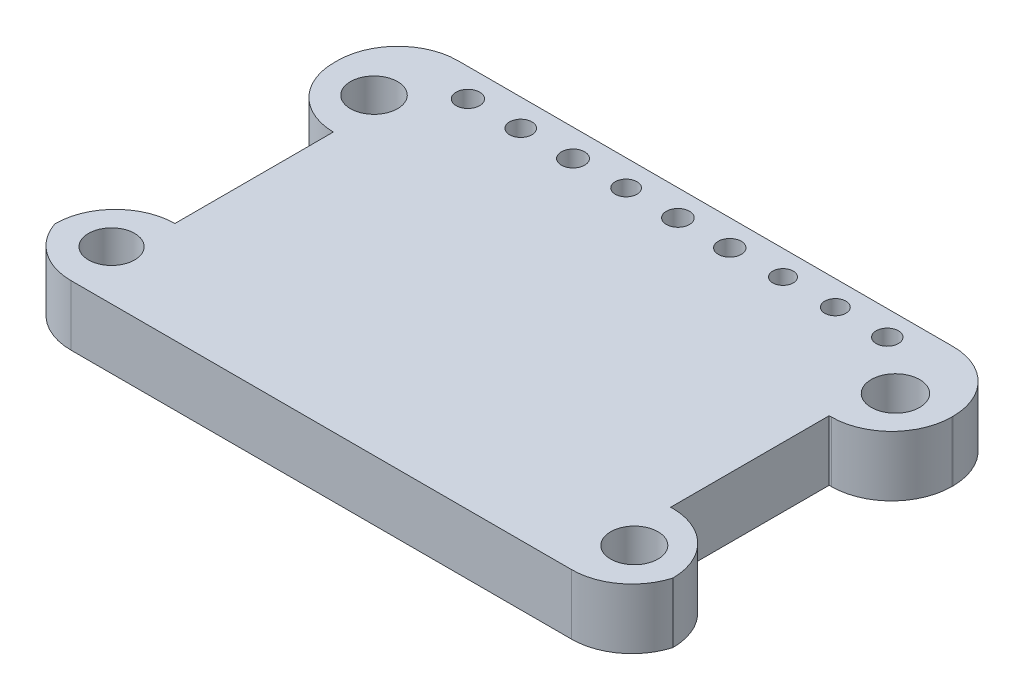
ISO-10303-21;
HEADER;
FILE_DESCRIPTION(('STEP AP214'),'2;1');
FILE_NAME('part.step','',(''),(''),'','','');
FILE_SCHEMA(('AUTOMOTIVE_DESIGN { 1 0 10303 214 1 1 1 1 }'));
ENDSEC;
DATA;
#1=APPLICATION_CONTEXT('core data for automotive mechanical design processes');
#2=APPLICATION_PROTOCOL_DEFINITION('international standard','automotive_design',2000,#1);
#3=PRODUCT_CONTEXT('',#1,'mechanical');
#4=PRODUCT('Part','Part','',(#3));
#5=PRODUCT_RELATED_PRODUCT_CATEGORY('part','',(#4));
#6=PRODUCT_DEFINITION_FORMATION('','',#4);
#7=PRODUCT_DEFINITION_CONTEXT('part definition',#1,'design');
#8=PRODUCT_DEFINITION('design','',#6,#7);
#9=PRODUCT_DEFINITION_SHAPE('','',#8);
#10=(LENGTH_UNIT() NAMED_UNIT(*) SI_UNIT(.MILLI.,.METRE.));
#11=(NAMED_UNIT(*) PLANE_ANGLE_UNIT() SI_UNIT($,.RADIAN.));
#12=(NAMED_UNIT(*) SI_UNIT($,.STERADIAN.) SOLID_ANGLE_UNIT());
#13=UNCERTAINTY_MEASURE_WITH_UNIT(LENGTH_MEASURE(1.E-05),#10,'distance_accuracy_value','');
#14=(GEOMETRIC_REPRESENTATION_CONTEXT(3) GLOBAL_UNCERTAINTY_ASSIGNED_CONTEXT((#13)) GLOBAL_UNIT_ASSIGNED_CONTEXT((#10,
#11,#12)) REPRESENTATION_CONTEXT('',''));
#15=CARTESIAN_POINT('',(0.,0.,0.));
#16=DIRECTION('',(0.,0.,1.));
#17=DIRECTION('',(1.,0.,0.));
#18=AXIS2_PLACEMENT_3D('',#15,#16,#17);
#19=CARTESIAN_POINT('',(30.65,3.,0.));
#20=DIRECTION('',(-1.,0.,0.));
#21=DIRECTION('',(0.,0.,1.));
#22=AXIS2_PLACEMENT_3D('',#19,#20,#21);
#23=PLANE('',#22);
#24=DIRECTION('',(0.,0.,-1.));
#25=VECTOR('',#24,1.);
#26=CARTESIAN_POINT('',(30.65,0.,0.));
#27=LINE('',#26,#25);
#28=CARTESIAN_POINT('',(30.65,0.,-16.0433014459896));
#29=VERTEX_POINT('',#28);
#30=CARTESIAN_POINT('',(30.65,0.,-16.11));
#31=VERTEX_POINT('',#30);
#32=EDGE_CURVE('E217',#29,#31,#27,.T.);
#33=ORIENTED_EDGE('',*,*,#32,.T.);
#34=DIRECTION('',(0.,-1.,0.));
#35=VECTOR('',#34,1.);
#36=CARTESIAN_POINT('',(30.65,3.,-16.11));
#37=LINE('',#36,#35);
#38=CARTESIAN_POINT('',(30.65,3.,-16.11));
#39=VERTEX_POINT('',#38);
#40=EDGE_CURVE('E200',#31,#39,#37,.F.);
#41=ORIENTED_EDGE('',*,*,#40,.T.);
#42=DIRECTION('',(0.,0.,-1.));
#43=VECTOR('',#42,1.);
#44=CARTESIAN_POINT('',(30.65,3.,0.));
#45=LINE('',#44,#43);
#46=CARTESIAN_POINT('',(30.65,3.,-16.0433014459896));
#47=VERTEX_POINT('',#46);
#48=EDGE_CURVE('E266',#47,#39,#45,.T.);
#49=ORIENTED_EDGE('',*,*,#48,.F.);
#50=DIRECTION('',(0.,1.,0.));
#51=VECTOR('',#50,1.);
#52=CARTESIAN_POINT('',(30.65,3.,-16.0433014459896));
#53=LINE('',#52,#51);
#54=EDGE_CURVE('E238',#47,#29,#53,.F.);
#55=ORIENTED_EDGE('',*,*,#54,.T.);
#56=EDGE_LOOP('',(#33,#41,#49,#55));
#57=FACE_BOUND('',#56,.T.);
#58=ADVANCED_FACE('F38',(#57),#23,.F.);
#59=CARTESIAN_POINT('',(0.,3.,0.));
#60=DIRECTION('',(1.,0.,0.));
#61=DIRECTION('',(0.,0.,-1.));
#62=AXIS2_PLACEMENT_3D('',#59,#60,#61);
#63=PLANE('',#62);
#64=DIRECTION('',(0.,0.,1.));
#65=VECTOR('',#64,1.);
#66=CARTESIAN_POINT('',(0.,3.,0.));
#67=LINE('',#66,#65);
#68=CARTESIAN_POINT('',(0.,3.,-16.11));
#69=VERTEX_POINT('',#68);
#70=CARTESIAN_POINT('',(0.,3.,-15.9336723742656));
#71=VERTEX_POINT('',#70);
#72=EDGE_CURVE('E229',#69,#71,#67,.T.);
#73=ORIENTED_EDGE('',*,*,#72,.F.);
#74=DIRECTION('',(0.,-1.,0.));
#75=VECTOR('',#74,1.);
#76=CARTESIAN_POINT('',(0.,3.,-16.11));
#77=LINE('',#76,#75);
#78=CARTESIAN_POINT('',(0.,0.,-16.11));
#79=VERTEX_POINT('',#78);
#80=EDGE_CURVE('E11',#69,#79,#77,.T.);
#81=ORIENTED_EDGE('',*,*,#80,.T.);
#82=DIRECTION('',(0.,0.,1.));
#83=VECTOR('',#82,1.);
#84=CARTESIAN_POINT('',(0.,0.,0.));
#85=LINE('',#84,#83);
#86=CARTESIAN_POINT('',(0.,0.,-15.9336723742656));
#87=VERTEX_POINT('',#86);
#88=EDGE_CURVE('E218',#79,#87,#85,.T.);
#89=ORIENTED_EDGE('',*,*,#88,.T.);
#90=DIRECTION('',(0.,-1.,0.));
#91=VECTOR('',#90,1.);
#92=CARTESIAN_POINT('',(0.,3.,-15.9336723742656));
#93=LINE('',#92,#91);
#94=EDGE_CURVE('E178',#87,#71,#93,.F.);
#95=ORIENTED_EDGE('',*,*,#94,.T.);
#96=EDGE_LOOP('',(#73,#81,#89,#95));
#97=FACE_BOUND('',#96,.T.);
#98=ADVANCED_FACE('F255',(#97),#63,.F.);
#99=CARTESIAN_POINT('',(0.,3.,0.));
#100=DIRECTION('',(0.,0.,-1.));
#101=DIRECTION('',(-1.,0.,0.));
#102=AXIS2_PLACEMENT_3D('',#99,#100,#101);
#103=PLANE('',#102);
#104=DIRECTION('',(1.,0.,0.));
#105=VECTOR('',#104,1.);
#106=CARTESIAN_POINT('',(0.,3.,0.));
#107=LINE('',#106,#105);
#108=CARTESIAN_POINT('',(2.84562995765223,3.,0.));
#109=VERTEX_POINT('',#108);
#110=CARTESIAN_POINT('',(27.7713387546784,3.,0.));
#111=VERTEX_POINT('',#110);
#112=EDGE_CURVE('E214',#109,#111,#107,.T.);
#113=ORIENTED_EDGE('',*,*,#112,.F.);
#114=DIRECTION('',(0.,1.,0.));
#115=VECTOR('',#114,1.);
#116=CARTESIAN_POINT('',(2.84562995765223,3.,0.));
#117=LINE('',#116,#115);
#118=CARTESIAN_POINT('',(2.84562995765223,0.,0.));
#119=VERTEX_POINT('',#118);
#120=EDGE_CURVE('E46',#109,#119,#117,.F.);
#121=ORIENTED_EDGE('',*,*,#120,.T.);
#122=DIRECTION('',(1.,0.,0.));
#123=VECTOR('',#122,1.);
#124=CARTESIAN_POINT('',(0.,0.,0.));
#125=LINE('',#124,#123);
#126=CARTESIAN_POINT('',(27.7713387546784,0.,0.));
#127=VERTEX_POINT('',#126);
#128=EDGE_CURVE('E213',#119,#127,#125,.T.);
#129=ORIENTED_EDGE('',*,*,#128,.T.);
#130=DIRECTION('',(0.,1.,0.));
#131=VECTOR('',#130,1.);
#132=CARTESIAN_POINT('',(27.7713387546784,3.,0.));
#133=LINE('',#132,#131);
#134=EDGE_CURVE('E53',#127,#111,#133,.T.);
#135=ORIENTED_EDGE('',*,*,#134,.T.);
#136=EDGE_LOOP('',(#113,#121,#129,#135));
#137=FACE_BOUND('',#136,.T.);
#138=ADVANCED_FACE('F212',(#137),#103,.F.);
#139=CARTESIAN_POINT('',(0.,3.,-19.11));
#140=DIRECTION('',(0.,0.,1.));
#141=DIRECTION('',(1.,0.,0.));
#142=AXIS2_PLACEMENT_3D('',#139,#140,#141);
#143=PLANE('',#142);
#144=DIRECTION('',(-1.,0.,0.));
#145=VECTOR('',#144,1.);
#146=CARTESIAN_POINT('',(0.,3.,-19.11));
#147=LINE('',#146,#145);
#148=CARTESIAN_POINT('',(27.65,3.,-19.11));
#149=VERTEX_POINT('',#148);
#150=CARTESIAN_POINT('',(3.,3.,-19.11));
#151=VERTEX_POINT('',#150);
#152=EDGE_CURVE('E234',#149,#151,#147,.T.);
#153=ORIENTED_EDGE('',*,*,#152,.F.);
#154=DIRECTION('',(0.,-1.,0.));
#155=VECTOR('',#154,1.);
#156=CARTESIAN_POINT('',(27.65,3.,-19.11));
#157=LINE('',#156,#155);
#158=CARTESIAN_POINT('',(27.65,0.,-19.11));
#159=VERTEX_POINT('',#158);
#160=EDGE_CURVE('E189',#149,#159,#157,.T.);
#161=ORIENTED_EDGE('',*,*,#160,.T.);
#162=DIRECTION('',(-1.,0.,0.));
#163=VECTOR('',#162,1.);
#164=CARTESIAN_POINT('',(0.,0.,-19.11));
#165=LINE('',#164,#163);
#166=CARTESIAN_POINT('',(3.,0.,-19.11));
#167=VERTEX_POINT('',#166);
#168=EDGE_CURVE('E221',#159,#167,#165,.T.);
#169=ORIENTED_EDGE('',*,*,#168,.T.);
#170=DIRECTION('',(0.,-1.,0.));
#171=VECTOR('',#170,1.);
#172=CARTESIAN_POINT('',(3.,3.,-19.11));
#173=LINE('',#172,#171);
#174=EDGE_CURVE('E182',#167,#151,#173,.F.);
#175=ORIENTED_EDGE('',*,*,#174,.T.);
#176=EDGE_LOOP('',(#153,#161,#169,#175));
#177=FACE_BOUND('',#176,.T.);
#178=ADVANCED_FACE('F261',(#177),#143,.F.);
#179=CARTESIAN_POINT('',(0.,3.,0.));
#180=DIRECTION('',(0.,-1.,0.));
#181=DIRECTION('',(0.,0.,-1.));
#182=AXIS2_PLACEMENT_3D('',#179,#180,#181);
#183=PLANE('',#182);
#184=CARTESIAN_POINT('',(23.0182736628564,3.,-17.8750131787133));
#185=DIRECTION('',(0.,1.,0.));
#186=DIRECTION('',(0.,0.,1.));
#187=AXIS2_PLACEMENT_3D('',#184,#185,#186);
#188=CIRCLE('',#187,0.526160779684508);
#189=CARTESIAN_POINT('',(23.0182736628564,3.,-17.3488523990288));
#190=VERTEX_POINT('',#189);
#191=EDGE_CURVE('E366',#190,#190,#188,.T.);
#192=ORIENTED_EDGE('',*,*,#191,.F.);
#193=EDGE_LOOP('',(#192));
#194=FACE_BOUND('',#193,.T.);
#195=CARTESIAN_POINT('',(20.4146410542592,3.,-17.8750131787133));
#196=DIRECTION('',(0.,1.,0.));
#197=DIRECTION('',(0.,0.,1.));
#198=AXIS2_PLACEMENT_3D('',#195,#196,#197);
#199=CIRCLE('',#198,0.5116223200349);
#200=CARTESIAN_POINT('',(20.4146410542592,3.,-17.3633908586784));
#201=VERTEX_POINT('',#200);
#202=EDGE_CURVE('E360',#201,#201,#199,.T.);
#203=ORIENTED_EDGE('',*,*,#202,.F.);
#204=EDGE_LOOP('',(#203));
#205=FACE_BOUND('',#204,.T.);
#206=CARTESIAN_POINT('',(17.8321852748269,3.,-17.8080853071805));
#207=DIRECTION('',(0.,1.,0.));
#208=DIRECTION('',(0.,0.,1.));
#209=AXIS2_PLACEMENT_3D('',#206,#207,#208);
#210=CIRCLE('',#209,0.570497963200171);
#211=CARTESIAN_POINT('',(17.8321852748269,3.,-17.2375873439803));
#212=VERTEX_POINT('',#211);
#213=EDGE_CURVE('E354',#212,#212,#210,.T.);
#214=ORIENTED_EDGE('',*,*,#213,.F.);
#215=EDGE_LOOP('',(#214));
#216=FACE_BOUND('',#215,.T.);
#217=CARTESIAN_POINT('',(15.2505882629512,3.,-17.8080853071805));
#218=DIRECTION('',(0.,1.,0.));
#219=DIRECTION('',(0.,0.,1.));
#220=AXIS2_PLACEMENT_3D('',#217,#218,#219);
#221=CIRCLE('',#220,0.574861319265319);
#222=CARTESIAN_POINT('',(15.2505882629512,3.,-17.2332239879152));
#223=VERTEX_POINT('',#222);
#224=EDGE_CURVE('E348',#223,#223,#221,.T.);
#225=ORIENTED_EDGE('',*,*,#224,.F.);
#226=EDGE_LOOP('',(#225));
#227=FACE_BOUND('',#226,.T.);
#228=CARTESIAN_POINT('',(12.6729514407486,3.,-17.8080853071805));
#229=DIRECTION('',(0.,1.,0.));
#230=DIRECTION('',(0.,0.,1.));
#231=AXIS2_PLACEMENT_3D('',#228,#229,#230);
#232=CIRCLE('',#231,0.542267602418071);
#233=CARTESIAN_POINT('',(12.6729514407486,3.,-17.2658177047624));
#234=VERTEX_POINT('',#233);
#235=EDGE_CURVE('E342',#234,#234,#232,.T.);
#236=ORIENTED_EDGE('',*,*,#235,.F.);
#237=EDGE_LOOP('',(#236));
#238=FACE_BOUND('',#237,.T.);
#239=CARTESIAN_POINT('',(10.0810166352403,3.,-17.7567837482542));
#240=DIRECTION('',(0.,1.,0.));
#241=DIRECTION('',(0.,0.,1.));
#242=AXIS2_PLACEMENT_3D('',#239,#240,#241);
#243=CIRCLE('',#242,0.579469216155815);
#244=CARTESIAN_POINT('',(10.0810166352403,3.,-17.1773145320984));
#245=VERTEX_POINT('',#244);
#246=EDGE_CURVE('E336',#245,#245,#243,.T.);
#247=ORIENTED_EDGE('',*,*,#246,.F.);
#248=EDGE_LOOP('',(#247));
#249=FACE_BOUND('',#248,.T.);
#250=CARTESIAN_POINT('',(7.47920475613206,3.,-17.7567837482542));
#251=DIRECTION('',(0.,1.,0.));
#252=DIRECTION('',(0.,0.,1.));
#253=AXIS2_PLACEMENT_3D('',#250,#251,#252);
#254=CIRCLE('',#253,0.558015666292988);
#255=CARTESIAN_POINT('',(7.47920475613206,3.,-17.1987680819612));
#256=VERTEX_POINT('',#255);
#257=EDGE_CURVE('E330',#256,#256,#254,.T.);
#258=ORIENTED_EDGE('',*,*,#257,.F.);
#259=EDGE_LOOP('',(#258));
#260=FACE_BOUND('',#259,.T.);
#261=CARTESIAN_POINT('',(4.89567999498952,3.,-17.7104898572402));
#262=DIRECTION('',(0.,1.,0.));
#263=DIRECTION('',(0.,0.,1.));
#264=AXIS2_PLACEMENT_3D('',#261,#262,#263);
#265=CIRCLE('',#264,0.58620570776483);
#266=CARTESIAN_POINT('',(4.89567999498952,3.,-17.1242841494754));
#267=VERTEX_POINT('',#266);
#268=EDGE_CURVE('E324',#267,#267,#265,.T.);
#269=ORIENTED_EDGE('',*,*,#268,.F.);
#270=EDGE_LOOP('',(#269));
#271=FACE_BOUND('',#270,.T.);
#272=CARTESIAN_POINT('',(25.6037353122505,3.,-17.8750131787133));
#273=DIRECTION('',(0.,1.,0.));
#274=DIRECTION('',(0.,0.,1.));
#275=AXIS2_PLACEMENT_3D('',#272,#273,#274);
#276=CIRCLE('',#275,0.553427196099474);
#277=CARTESIAN_POINT('',(25.6037353122505,3.,-17.3215859826138));
#278=VERTEX_POINT('',#277);
#279=EDGE_CURVE('E318',#278,#278,#276,.T.);
#280=ORIENTED_EDGE('',*,*,#279,.F.);
#281=EDGE_LOOP('',(#280));
#282=FACE_BOUND('',#281,.T.);
#283=CARTESIAN_POINT('',(2.39767593557294,3.,-15.5346285472948));
#284=DIRECTION('',(0.,1.,0.));
#285=DIRECTION('',(0.,0.,1.));
#286=AXIS2_PLACEMENT_3D('',#283,#284,#285);
#287=CIRCLE('',#286,1.17181229809716);
#288=CARTESIAN_POINT('',(2.39767593557294,3.,-14.3628162491977));
#289=VERTEX_POINT('',#288);
#290=EDGE_CURVE('E313',#289,#289,#287,.T.);
#291=ORIENTED_EDGE('',*,*,#290,.F.);
#292=EDGE_LOOP('',(#291));
#293=FACE_BOUND('',#292,.T.);
#294=CARTESIAN_POINT('',(28.2333568389265,3.,-15.6521206853406));
#295=DIRECTION('',(0.,1.,0.));
#296=DIRECTION('',(0.,0.,1.));
#297=AXIS2_PLACEMENT_3D('',#294,#295,#296);
#298=CIRCLE('',#297,1.2047862142031);
#299=CARTESIAN_POINT('',(28.2333568389265,3.,-14.4473344711375));
#300=VERTEX_POINT('',#299);
#301=EDGE_CURVE('E307',#300,#300,#298,.T.);
#302=ORIENTED_EDGE('',*,*,#301,.F.);
#303=EDGE_LOOP('',(#302));
#304=FACE_BOUND('',#303,.T.);
#305=CARTESIAN_POINT('',(28.2839998568427,3.,-2.60430032095016));
#306=DIRECTION('',(0.,1.,0.));
#307=DIRECTION('',(0.,0.,1.));
#308=AXIS2_PLACEMENT_3D('',#305,#306,#307);
#309=CIRCLE('',#308,1.1798453258494);
#310=CARTESIAN_POINT('',(28.2839998568427,3.,-1.42445499510076));
#311=VERTEX_POINT('',#310);
#312=EDGE_CURVE('E300',#311,#311,#309,.T.);
#313=ORIENTED_EDGE('',*,*,#312,.F.);
#314=EDGE_LOOP('',(#313));
#315=FACE_BOUND('',#314,.T.);
#316=CARTESIAN_POINT('',(2.39767593557294,3.,-2.47256203262958));
#317=DIRECTION('',(0.,1.,0.));
#318=DIRECTION('',(0.,0.,1.));
#319=AXIS2_PLACEMENT_3D('',#316,#317,#318);
#320=CIRCLE('',#319,1.14747653076824);
#321=CARTESIAN_POINT('',(2.39767593557294,3.,-1.32508550186134));
#322=VERTEX_POINT('',#321);
#323=EDGE_CURVE('E294',#322,#322,#320,.T.);
#324=ORIENTED_EDGE('',*,*,#323,.F.);
#325=EDGE_LOOP('',(#324));
#326=FACE_BOUND('',#325,.T.);
#327=ORIENTED_EDGE('',*,*,#48,.T.);
#328=CARTESIAN_POINT('',(27.65,3.,-16.11));
#329=DIRECTION('',(0.,-1.,0.));
#330=DIRECTION('',(0.,0.,-1.));
#331=AXIS2_PLACEMENT_3D('',#328,#329,#330);
#332=CIRCLE('',#331,3.);
#333=EDGE_CURVE('E207',#39,#149,#332,.F.);
#334=ORIENTED_EDGE('',*,*,#333,.T.);
#335=ORIENTED_EDGE('',*,*,#152,.T.);
#336=CARTESIAN_POINT('',(3.,3.,-16.11));
#337=DIRECTION('',(0.,-1.,0.));
#338=DIRECTION('',(0.,0.,-1.));
#339=AXIS2_PLACEMENT_3D('',#336,#337,#338);
#340=CIRCLE('',#339,3.);
#341=EDGE_CURVE('E202',#151,#69,#340,.F.);
#342=ORIENTED_EDGE('',*,*,#341,.T.);
#343=ORIENTED_EDGE('',*,*,#72,.T.);
#344=CARTESIAN_POINT('',(3.,3.,-15.9336723742656));
#345=DIRECTION('',(0.,-1.,0.));
#346=DIRECTION('',(0.,0.,-1.));
#347=AXIS2_PLACEMENT_3D('',#344,#345,#346);
#348=CIRCLE('',#347,3.);
#349=CARTESIAN_POINT('',(2.97390392747587,3.,-12.9337858772463));
#350=VERTEX_POINT('',#349);
#351=EDGE_CURVE('E184',#71,#350,#348,.F.);
#352=ORIENTED_EDGE('',*,*,#351,.T.);
#353=DIRECTION('',(0.,0.,-1.));
#354=VECTOR('',#353,1.);
#355=CARTESIAN_POINT('',(2.97390392747587,3.,-5.04994431766725));
#356=LINE('',#355,#354);
#357=CARTESIAN_POINT('',(2.97390392747587,3.,-5.04994431766725));
#358=VERTEX_POINT('',#357);
#359=EDGE_CURVE('E160',#358,#350,#356,.T.);
#360=ORIENTED_EDGE('',*,*,#359,.F.);
#361=CARTESIAN_POINT('',(3.,3.,-2.05005782064794));
#362=DIRECTION('',(0.,-1.,0.));
#363=DIRECTION('',(0.,0.,-1.));
#364=AXIS2_PLACEMENT_3D('',#361,#362,#363);
#365=CIRCLE('',#364,3.);
#366=CARTESIAN_POINT('',(0.,3.,-2.05005782064794));
#367=VERTEX_POINT('',#366);
#368=EDGE_CURVE('E250',#358,#367,#365,.F.);
#369=ORIENTED_EDGE('',*,*,#368,.T.);
#370=CARTESIAN_POINT('',(2.84562995765223,3.,-3.));
#371=DIRECTION('',(0.,-1.,0.));
#372=DIRECTION('',(0.,0.,-1.));
#373=AXIS2_PLACEMENT_3D('',#370,#371,#372);
#374=CIRCLE('',#373,3.);
#375=EDGE_CURVE('E60',#367,#109,#374,.F.);
#376=ORIENTED_EDGE('',*,*,#375,.T.);
#377=ORIENTED_EDGE('',*,*,#112,.T.);
#378=CARTESIAN_POINT('',(27.7713387546784,3.,-3.));
#379=DIRECTION('',(0.,-1.,0.));
#380=DIRECTION('',(0.,0.,-1.));
#381=AXIS2_PLACEMENT_3D('',#378,#379,#380);
#382=CIRCLE('',#381,3.);
#383=CARTESIAN_POINT('',(30.65,3.,-2.15542351756437));
#384=VERTEX_POINT('',#383);
#385=EDGE_CURVE('E204',#111,#384,#382,.F.);
#386=ORIENTED_EDGE('',*,*,#385,.T.);
#387=CARTESIAN_POINT('',(27.65,3.,-2.15542351756437));
#388=DIRECTION('',(0.,-1.,0.));
#389=DIRECTION('',(0.,0.,-1.));
#390=AXIS2_PLACEMENT_3D('',#387,#388,#389);
#391=CIRCLE('',#390,3.);
#392=CARTESIAN_POINT('',(27.65,3.,-5.15542351756437));
#393=VERTEX_POINT('',#392);
#394=EDGE_CURVE('E233',#384,#393,#391,.F.);
#395=ORIENTED_EDGE('',*,*,#394,.T.);
#396=DIRECTION('',(1.,0.,0.));
#397=VECTOR('',#396,1.);
#398=CARTESIAN_POINT('',(27.5426581614582,3.,-5.15542351756437));
#399=LINE('',#398,#397);
#400=CARTESIAN_POINT('',(27.5426581614582,3.,-5.15542351756437));
#401=VERTEX_POINT('',#400);
#402=EDGE_CURVE('E279',#401,#393,#399,.T.);
#403=ORIENTED_EDGE('',*,*,#402,.F.);
#404=DIRECTION('',(0.,0.,1.));
#405=VECTOR('',#404,1.);
#406=CARTESIAN_POINT('',(27.5426581614582,3.,-13.0433014459896));
#407=LINE('',#406,#405);
#408=CARTESIAN_POINT('',(27.5426581614582,3.,-13.0433014459896));
#409=VERTEX_POINT('',#408);
#410=EDGE_CURVE('E282',#409,#401,#407,.T.);
#411=ORIENTED_EDGE('',*,*,#410,.F.);
#412=DIRECTION('',(-1.,0.,0.));
#413=VECTOR('',#412,1.);
#414=CARTESIAN_POINT('',(27.5426581614582,3.,-13.0433014459896));
#415=LINE('',#414,#413);
#416=CARTESIAN_POINT('',(27.65,3.,-13.0433014459896));
#417=VERTEX_POINT('',#416);
#418=EDGE_CURVE('E276',#417,#409,#415,.T.);
#419=ORIENTED_EDGE('',*,*,#418,.F.);
#420=CARTESIAN_POINT('',(27.65,3.,-16.0433014459896));
#421=DIRECTION('',(0.,-1.,0.));
#422=DIRECTION('',(0.,0.,-1.));
#423=AXIS2_PLACEMENT_3D('',#420,#421,#422);
#424=CIRCLE('',#423,3.);
#425=EDGE_CURVE('E236',#417,#47,#424,.F.);
#426=ORIENTED_EDGE('',*,*,#425,.T.);
#427=EDGE_LOOP('',(#327,#334,#335,#342,#343,#352,#360,#369,#376,#377,#386,#395,#403,#411,#419,#426));
#428=FACE_BOUND('',#427,.T.);
#429=ADVANCED_FACE('F252',(#194,#205,#216,#227,#238,#249,#260,#271,#282,#293,#304,#315,#326,
#428),#183,.F.);
#430=CARTESIAN_POINT('',(0.,0.,0.));
#431=DIRECTION('',(0.,-1.,0.));
#432=DIRECTION('',(0.,0.,-1.));
#433=AXIS2_PLACEMENT_3D('',#430,#431,#432);
#434=PLANE('',#433);
#435=CARTESIAN_POINT('',(23.0182736628564,0.,-17.8750131787133));
#436=DIRECTION('',(0.,1.,0.));
#437=DIRECTION('',(0.,0.,1.));
#438=AXIS2_PLACEMENT_3D('',#435,#436,#437);
#439=CIRCLE('',#438,0.526160779684508);
#440=CARTESIAN_POINT('',(23.0182736628564,0.,-17.3488523990288));
#441=VERTEX_POINT('',#440);
#442=EDGE_CURVE('E321',#441,#441,#439,.T.);
#443=ORIENTED_EDGE('',*,*,#442,.T.);
#444=EDGE_LOOP('',(#443));
#445=FACE_BOUND('',#444,.T.);
#446=CARTESIAN_POINT('',(20.4146410542592,0.,-17.8750131787133));
#447=DIRECTION('',(0.,1.,0.));
#448=DIRECTION('',(0.,0.,1.));
#449=AXIS2_PLACEMENT_3D('',#446,#447,#448);
#450=CIRCLE('',#449,0.5116223200349);
#451=CARTESIAN_POINT('',(20.4146410542592,0.,-17.3633908586784));
#452=VERTEX_POINT('',#451);
#453=EDGE_CURVE('E363',#452,#452,#450,.T.);
#454=ORIENTED_EDGE('',*,*,#453,.T.);
#455=EDGE_LOOP('',(#454));
#456=FACE_BOUND('',#455,.T.);
#457=CARTESIAN_POINT('',(17.8321852748269,0.,-17.8080853071805));
#458=DIRECTION('',(0.,1.,0.));
#459=DIRECTION('',(0.,0.,1.));
#460=AXIS2_PLACEMENT_3D('',#457,#458,#459);
#461=CIRCLE('',#460,0.570497963200171);
#462=CARTESIAN_POINT('',(17.8321852748269,0.,-17.2375873439803));
#463=VERTEX_POINT('',#462);
#464=EDGE_CURVE('E357',#463,#463,#461,.T.);
#465=ORIENTED_EDGE('',*,*,#464,.T.);
#466=EDGE_LOOP('',(#465));
#467=FACE_BOUND('',#466,.T.);
#468=CARTESIAN_POINT('',(15.2505882629512,0.,-17.8080853071805));
#469=DIRECTION('',(0.,1.,0.));
#470=DIRECTION('',(0.,0.,1.));
#471=AXIS2_PLACEMENT_3D('',#468,#469,#470);
#472=CIRCLE('',#471,0.574861319265319);
#473=CARTESIAN_POINT('',(15.2505882629512,0.,-17.2332239879152));
#474=VERTEX_POINT('',#473);
#475=EDGE_CURVE('E351',#474,#474,#472,.T.);
#476=ORIENTED_EDGE('',*,*,#475,.T.);
#477=EDGE_LOOP('',(#476));
#478=FACE_BOUND('',#477,.T.);
#479=CARTESIAN_POINT('',(12.6729514407486,0.,-17.8080853071805));
#480=DIRECTION('',(0.,1.,0.));
#481=DIRECTION('',(0.,0.,1.));
#482=AXIS2_PLACEMENT_3D('',#479,#480,#481);
#483=CIRCLE('',#482,0.542267602418071);
#484=CARTESIAN_POINT('',(12.6729514407486,0.,-17.2658177047624));
#485=VERTEX_POINT('',#484);
#486=EDGE_CURVE('E345',#485,#485,#483,.T.);
#487=ORIENTED_EDGE('',*,*,#486,.T.);
#488=EDGE_LOOP('',(#487));
#489=FACE_BOUND('',#488,.T.);
#490=CARTESIAN_POINT('',(10.0810166352403,0.,-17.7567837482542));
#491=DIRECTION('',(0.,1.,0.));
#492=DIRECTION('',(0.,0.,1.));
#493=AXIS2_PLACEMENT_3D('',#490,#491,#492);
#494=CIRCLE('',#493,0.579469216155815);
#495=CARTESIAN_POINT('',(10.0810166352403,0.,-17.1773145320984));
#496=VERTEX_POINT('',#495);
#497=EDGE_CURVE('E339',#496,#496,#494,.T.);
#498=ORIENTED_EDGE('',*,*,#497,.T.);
#499=EDGE_LOOP('',(#498));
#500=FACE_BOUND('',#499,.T.);
#501=CARTESIAN_POINT('',(7.47920475613206,0.,-17.7567837482542));
#502=DIRECTION('',(0.,1.,0.));
#503=DIRECTION('',(0.,0.,1.));
#504=AXIS2_PLACEMENT_3D('',#501,#502,#503);
#505=CIRCLE('',#504,0.558015666292988);
#506=CARTESIAN_POINT('',(7.47920475613206,0.,-17.1987680819612));
#507=VERTEX_POINT('',#506);
#508=EDGE_CURVE('E333',#507,#507,#505,.T.);
#509=ORIENTED_EDGE('',*,*,#508,.T.);
#510=EDGE_LOOP('',(#509));
#511=FACE_BOUND('',#510,.T.);
#512=CARTESIAN_POINT('',(4.89567999498952,0.,-17.7104898572402));
#513=DIRECTION('',(0.,1.,0.));
#514=DIRECTION('',(0.,0.,1.));
#515=AXIS2_PLACEMENT_3D('',#512,#513,#514);
#516=CIRCLE('',#515,0.58620570776483);
#517=CARTESIAN_POINT('',(4.89567999498952,0.,-17.1242841494754));
#518=VERTEX_POINT('',#517);
#519=EDGE_CURVE('E327',#518,#518,#516,.T.);
#520=ORIENTED_EDGE('',*,*,#519,.T.);
#521=EDGE_LOOP('',(#520));
#522=FACE_BOUND('',#521,.T.);
#523=CARTESIAN_POINT('',(25.6037353122505,0.,-17.8750131787133));
#524=DIRECTION('',(0.,1.,0.));
#525=DIRECTION('',(0.,0.,1.));
#526=AXIS2_PLACEMENT_3D('',#523,#524,#525);
#527=CIRCLE('',#526,0.553427196099474);
#528=CARTESIAN_POINT('',(25.6037353122505,0.,-17.3215859826138));
#529=VERTEX_POINT('',#528);
#530=EDGE_CURVE('E304',#529,#529,#527,.T.);
#531=ORIENTED_EDGE('',*,*,#530,.T.);
#532=EDGE_LOOP('',(#531));
#533=FACE_BOUND('',#532,.T.);
#534=CARTESIAN_POINT('',(2.39767593557294,0.,-15.5346285472948));
#535=DIRECTION('',(0.,1.,0.));
#536=DIRECTION('',(0.,0.,1.));
#537=AXIS2_PLACEMENT_3D('',#534,#535,#536);
#538=CIRCLE('',#537,1.17181229809716);
#539=CARTESIAN_POINT('',(2.39767593557294,0.,-14.3628162491977));
#540=VERTEX_POINT('',#539);
#541=EDGE_CURVE('E297',#540,#540,#538,.T.);
#542=ORIENTED_EDGE('',*,*,#541,.T.);
#543=EDGE_LOOP('',(#542));
#544=FACE_BOUND('',#543,.T.);
#545=CARTESIAN_POINT('',(28.2333568389265,0.,-15.6521206853406));
#546=DIRECTION('',(0.,1.,0.));
#547=DIRECTION('',(0.,0.,1.));
#548=AXIS2_PLACEMENT_3D('',#545,#546,#547);
#549=CIRCLE('',#548,1.2047862142031);
#550=CARTESIAN_POINT('',(28.2333568389265,0.,-14.4473344711375));
#551=VERTEX_POINT('',#550);
#552=EDGE_CURVE('E310',#551,#551,#549,.T.);
#553=ORIENTED_EDGE('',*,*,#552,.T.);
#554=EDGE_LOOP('',(#553));
#555=FACE_BOUND('',#554,.T.);
#556=CARTESIAN_POINT('',(28.2839998568427,0.,-2.60430032095016));
#557=DIRECTION('',(0.,1.,0.));
#558=DIRECTION('',(0.,0.,1.));
#559=AXIS2_PLACEMENT_3D('',#556,#557,#558);
#560=CIRCLE('',#559,1.1798453258494);
#561=CARTESIAN_POINT('',(28.2839998568427,0.,-1.42445499510076));
#562=VERTEX_POINT('',#561);
#563=EDGE_CURVE('E303',#562,#562,#560,.T.);
#564=ORIENTED_EDGE('',*,*,#563,.T.);
#565=EDGE_LOOP('',(#564));
#566=FACE_BOUND('',#565,.T.);
#567=CARTESIAN_POINT('',(2.39767593557294,0.,-2.47256203262958));
#568=DIRECTION('',(0.,1.,0.));
#569=DIRECTION('',(0.,0.,1.));
#570=AXIS2_PLACEMENT_3D('',#567,#568,#569);
#571=CIRCLE('',#570,1.14747653076824);
#572=CARTESIAN_POINT('',(2.39767593557294,0.,-1.32508550186134));
#573=VERTEX_POINT('',#572);
#574=EDGE_CURVE('E292',#573,#573,#571,.T.);
#575=ORIENTED_EDGE('',*,*,#574,.T.);
#576=EDGE_LOOP('',(#575));
#577=FACE_BOUND('',#576,.T.);
#578=ORIENTED_EDGE('',*,*,#168,.F.);
#579=CARTESIAN_POINT('',(27.65,0.,-16.11));
#580=DIRECTION('',(0.,-1.,0.));
#581=DIRECTION('',(0.,0.,-1.));
#582=AXIS2_PLACEMENT_3D('',#579,#580,#581);
#583=CIRCLE('',#582,3.);
#584=EDGE_CURVE('E198',#159,#31,#583,.T.);
#585=ORIENTED_EDGE('',*,*,#584,.T.);
#586=ORIENTED_EDGE('',*,*,#32,.F.);
#587=CARTESIAN_POINT('',(27.65,0.,-16.0433014459896));
#588=DIRECTION('',(0.,-1.,0.));
#589=DIRECTION('',(0.,0.,-1.));
#590=AXIS2_PLACEMENT_3D('',#587,#588,#589);
#591=CIRCLE('',#590,3.);
#592=CARTESIAN_POINT('',(27.65,0.,-13.0433014459896));
#593=VERTEX_POINT('',#592);
#594=EDGE_CURVE('E242',#29,#593,#591,.T.);
#595=ORIENTED_EDGE('',*,*,#594,.T.);
#596=DIRECTION('',(-1.,0.,0.));
#597=VECTOR('',#596,1.);
#598=CARTESIAN_POINT('',(27.5426581614582,0.,-13.0433014459896));
#599=LINE('',#598,#597);
#600=CARTESIAN_POINT('',(27.5426581614582,0.,-13.0433014459896));
#601=VERTEX_POINT('',#600);
#602=EDGE_CURVE('E273',#593,#601,#599,.T.);
#603=ORIENTED_EDGE('',*,*,#602,.T.);
#604=DIRECTION('',(0.,0.,1.));
#605=VECTOR('',#604,1.);
#606=CARTESIAN_POINT('',(27.5426581614582,0.,-13.0433014459896));
#607=LINE('',#606,#605);
#608=CARTESIAN_POINT('',(27.5426581614582,0.,-5.15542351756437));
#609=VERTEX_POINT('',#608);
#610=EDGE_CURVE('E278',#601,#609,#607,.T.);
#611=ORIENTED_EDGE('',*,*,#610,.T.);
#612=DIRECTION('',(1.,0.,0.));
#613=VECTOR('',#612,1.);
#614=CARTESIAN_POINT('',(27.5426581614582,0.,-5.15542351756437));
#615=LINE('',#614,#613);
#616=CARTESIAN_POINT('',(27.65,0.,-5.15542351756437));
#617=VERTEX_POINT('',#616);
#618=EDGE_CURVE('E286',#609,#617,#615,.T.);
#619=ORIENTED_EDGE('',*,*,#618,.T.);
#620=CARTESIAN_POINT('',(27.65,0.,-2.15542351756437));
#621=DIRECTION('',(0.,-1.,0.));
#622=DIRECTION('',(0.,0.,-1.));
#623=AXIS2_PLACEMENT_3D('',#620,#621,#622);
#624=CIRCLE('',#623,3.);
#625=CARTESIAN_POINT('',(30.65,0.,-2.15542351756437));
#626=VERTEX_POINT('',#625);
#627=EDGE_CURVE('E240',#617,#626,#624,.T.);
#628=ORIENTED_EDGE('',*,*,#627,.T.);
#629=CARTESIAN_POINT('',(27.7713387546784,0.,-3.));
#630=DIRECTION('',(0.,-1.,0.));
#631=DIRECTION('',(0.,0.,-1.));
#632=AXIS2_PLACEMENT_3D('',#629,#630,#631);
#633=CIRCLE('',#632,3.);
#634=EDGE_CURVE('E194',#626,#127,#633,.T.);
#635=ORIENTED_EDGE('',*,*,#634,.T.);
#636=ORIENTED_EDGE('',*,*,#128,.F.);
#637=CARTESIAN_POINT('',(2.84562995765223,0.,-3.));
#638=DIRECTION('',(0.,-1.,0.));
#639=DIRECTION('',(0.,0.,-1.));
#640=AXIS2_PLACEMENT_3D('',#637,#638,#639);
#641=CIRCLE('',#640,3.);
#642=CARTESIAN_POINT('',(0.,0.,-2.05005782064794));
#643=VERTEX_POINT('',#642);
#644=EDGE_CURVE('E196',#119,#643,#641,.T.);
#645=ORIENTED_EDGE('',*,*,#644,.T.);
#646=CARTESIAN_POINT('',(3.,0.,-2.05005782064794));
#647=DIRECTION('',(0.,-1.,0.));
#648=DIRECTION('',(0.,0.,-1.));
#649=AXIS2_PLACEMENT_3D('',#646,#647,#648);
#650=CIRCLE('',#649,3.);
#651=CARTESIAN_POINT('',(2.97390392747587,0.,-5.04994431766725));
#652=VERTEX_POINT('',#651);
#653=EDGE_CURVE('E174',#643,#652,#650,.T.);
#654=ORIENTED_EDGE('',*,*,#653,.T.);
#655=DIRECTION('',(0.,0.,-1.));
#656=VECTOR('',#655,1.);
#657=CARTESIAN_POINT('',(2.97390392747587,0.,-5.04994431766725));
#658=LINE('',#657,#656);
#659=CARTESIAN_POINT('',(2.97390392747587,0.,-12.9337858772463));
#660=VERTEX_POINT('',#659);
#661=EDGE_CURVE('E157',#652,#660,#658,.T.);
#662=ORIENTED_EDGE('',*,*,#661,.T.);
#663=CARTESIAN_POINT('',(3.,0.,-15.9336723742656));
#664=DIRECTION('',(0.,-1.,0.));
#665=DIRECTION('',(0.,0.,-1.));
#666=AXIS2_PLACEMENT_3D('',#663,#664,#665);
#667=CIRCLE('',#666,3.);
#668=EDGE_CURVE('E171',#660,#87,#667,.T.);
#669=ORIENTED_EDGE('',*,*,#668,.T.);
#670=ORIENTED_EDGE('',*,*,#88,.F.);
#671=CARTESIAN_POINT('',(3.,0.,-16.11));
#672=DIRECTION('',(0.,-1.,0.));
#673=DIRECTION('',(0.,0.,-1.));
#674=AXIS2_PLACEMENT_3D('',#671,#672,#673);
#675=CIRCLE('',#674,3.);
#676=EDGE_CURVE('E192',#79,#167,#675,.T.);
#677=ORIENTED_EDGE('',*,*,#676,.T.);
#678=EDGE_LOOP('',(#578,#585,#586,#595,#603,#611,#619,#628,#635,#636,#645,#654,#662,#669,#670,#677));
#679=FACE_BOUND('',#678,.T.);
#680=ADVANCED_FACE('F169',(#445,#456,#467,#478,#489,#500,#511,#522,#533,#544,#555,#566,#577,
#679),#434,.T.);
#681=CARTESIAN_POINT('',(27.5426581614582,0.,-13.0433014459896));
#682=DIRECTION('',(-1.,0.,0.));
#683=DIRECTION('',(0.,0.,1.));
#684=AXIS2_PLACEMENT_3D('',#681,#682,#683);
#685=PLANE('',#684);
#686=ORIENTED_EDGE('',*,*,#410,.T.);
#687=DIRECTION('',(0.,1.,0.));
#688=VECTOR('',#687,1.);
#689=CARTESIAN_POINT('',(27.5426581614582,0.,-5.15542351756437));
#690=LINE('',#689,#688);
#691=EDGE_CURVE('E271',#609,#401,#690,.T.);
#692=ORIENTED_EDGE('',*,*,#691,.F.);
#693=ORIENTED_EDGE('',*,*,#610,.F.);
#694=DIRECTION('',(0.,1.,0.));
#695=VECTOR('',#694,1.);
#696=CARTESIAN_POINT('',(27.5426581614582,0.,-13.0433014459896));
#697=LINE('',#696,#695);
#698=EDGE_CURVE('E223',#601,#409,#697,.T.);
#699=ORIENTED_EDGE('',*,*,#698,.T.);
#700=EDGE_LOOP('',(#686,#692,#693,#699));
#701=FACE_BOUND('',#700,.T.);
#702=ADVANCED_FACE('F472',(#701),#685,.F.);
#703=CARTESIAN_POINT('',(27.5426581614582,0.,-13.0433014459896));
#704=DIRECTION('',(0.,0.,-1.));
#705=DIRECTION('',(-1.,0.,0.));
#706=AXIS2_PLACEMENT_3D('',#703,#704,#705);
#707=PLANE('',#706);
#708=ORIENTED_EDGE('',*,*,#602,.F.);
#709=DIRECTION('',(0.,1.,0.));
#710=VECTOR('',#709,1.);
#711=CARTESIAN_POINT('',(27.65,0.,-13.0433014459896));
#712=LINE('',#711,#710);
#713=EDGE_CURVE('E230',#593,#417,#712,.T.);
#714=ORIENTED_EDGE('',*,*,#713,.T.);
#715=ORIENTED_EDGE('',*,*,#418,.T.);
#716=ORIENTED_EDGE('',*,*,#698,.F.);
#717=EDGE_LOOP('',(#708,#714,#715,#716));
#718=FACE_BOUND('',#717,.T.);
#719=ADVANCED_FACE('F477',(#718),#707,.F.);
#720=CARTESIAN_POINT('',(27.5426581614582,0.,-5.15542351756437));
#721=DIRECTION('',(0.,0.,1.));
#722=DIRECTION('',(1.,0.,0.));
#723=AXIS2_PLACEMENT_3D('',#720,#721,#722);
#724=PLANE('',#723);
#725=ORIENTED_EDGE('',*,*,#402,.T.);
#726=DIRECTION('',(0.,1.,0.));
#727=VECTOR('',#726,1.);
#728=CARTESIAN_POINT('',(27.65,0.,-5.15542351756437));
#729=LINE('',#728,#727);
#730=EDGE_CURVE('E247',#393,#617,#729,.F.);
#731=ORIENTED_EDGE('',*,*,#730,.T.);
#732=ORIENTED_EDGE('',*,*,#618,.F.);
#733=ORIENTED_EDGE('',*,*,#691,.T.);
#734=EDGE_LOOP('',(#725,#731,#732,#733));
#735=FACE_BOUND('',#734,.T.);
#736=ADVANCED_FACE('F439',(#735),#724,.F.);
#737=CARTESIAN_POINT('',(27.65,0.,-16.0433014459896));
#738=DIRECTION('',(0.,1.,0.));
#739=DIRECTION('',(0.,0.,1.));
#740=AXIS2_PLACEMENT_3D('',#737,#738,#739);
#741=CYLINDRICAL_SURFACE('',#740,3.);
#742=ORIENTED_EDGE('',*,*,#594,.F.);
#743=ORIENTED_EDGE('',*,*,#54,.F.);
#744=ORIENTED_EDGE('',*,*,#425,.F.);
#745=ORIENTED_EDGE('',*,*,#713,.F.);
#746=EDGE_LOOP('',(#742,#743,#744,#745));
#747=FACE_BOUND('',#746,.T.);
#748=ADVANCED_FACE('F435',(#747),#741,.T.);
#749=CARTESIAN_POINT('',(27.65,3.,-2.15542351756437));
#750=DIRECTION('',(0.,1.,0.));
#751=DIRECTION('',(0.,0.,1.));
#752=AXIS2_PLACEMENT_3D('',#749,#750,#751);
#753=CYLINDRICAL_SURFACE('',#752,3.);
#754=ORIENTED_EDGE('',*,*,#627,.F.);
#755=ORIENTED_EDGE('',*,*,#730,.F.);
#756=ORIENTED_EDGE('',*,*,#394,.F.);
#757=DIRECTION('',(0.,1.,0.));
#758=VECTOR('',#757,1.);
#759=CARTESIAN_POINT('',(30.65,3.,-2.15542351756437));
#760=LINE('',#759,#758);
#761=EDGE_CURVE('E244',#626,#384,#760,.T.);
#762=ORIENTED_EDGE('',*,*,#761,.F.);
#763=EDGE_LOOP('',(#754,#755,#756,#762));
#764=FACE_BOUND('',#763,.T.);
#765=ADVANCED_FACE('F438',(#764),#753,.T.);
#766=CARTESIAN_POINT('',(2.97390392747587,0.,-5.04994431766725));
#767=DIRECTION('',(1.,0.,0.));
#768=DIRECTION('',(0.,0.,-1.));
#769=AXIS2_PLACEMENT_3D('',#766,#767,#768);
#770=PLANE('',#769);
#771=ORIENTED_EDGE('',*,*,#359,.T.);
#772=DIRECTION('',(0.,1.,0.));
#773=VECTOR('',#772,1.);
#774=CARTESIAN_POINT('',(2.97390392747587,0.,-12.9337858772463));
#775=LINE('',#774,#773);
#776=EDGE_CURVE('E153',#660,#350,#775,.T.);
#777=ORIENTED_EDGE('',*,*,#776,.F.);
#778=ORIENTED_EDGE('',*,*,#661,.F.);
#779=DIRECTION('',(0.,1.,0.));
#780=VECTOR('',#779,1.);
#781=CARTESIAN_POINT('',(2.97390392747587,0.,-5.04994431766725));
#782=LINE('',#781,#780);
#783=EDGE_CURVE('E164',#652,#358,#782,.T.);
#784=ORIENTED_EDGE('',*,*,#783,.T.);
#785=EDGE_LOOP('',(#771,#777,#778,#784));
#786=FACE_BOUND('',#785,.T.);
#787=ADVANCED_FACE('F155',(#786),#770,.F.);
#788=CARTESIAN_POINT('',(3.,0.,-15.9336723742656));
#789=DIRECTION('',(0.,-1.,0.));
#790=DIRECTION('',(0.,0.,-1.));
#791=AXIS2_PLACEMENT_3D('',#788,#789,#790);
#792=CYLINDRICAL_SURFACE('',#791,3.);
#793=ORIENTED_EDGE('',*,*,#668,.F.);
#794=ORIENTED_EDGE('',*,*,#776,.T.);
#795=ORIENTED_EDGE('',*,*,#351,.F.);
#796=ORIENTED_EDGE('',*,*,#94,.F.);
#797=EDGE_LOOP('',(#793,#794,#795,#796));
#798=FACE_BOUND('',#797,.T.);
#799=ADVANCED_FACE('F176',(#798),#792,.T.);
#800=CARTESIAN_POINT('',(3.,0.,-2.05005782064794));
#801=DIRECTION('',(0.,1.,0.));
#802=DIRECTION('',(0.,0.,1.));
#803=AXIS2_PLACEMENT_3D('',#800,#801,#802);
#804=CYLINDRICAL_SURFACE('',#803,3.);
#805=ORIENTED_EDGE('',*,*,#653,.F.);
#806=DIRECTION('',(0.,1.,0.));
#807=VECTOR('',#806,1.);
#808=CARTESIAN_POINT('',(0.,3.,-2.05005782064794));
#809=LINE('',#808,#807);
#810=EDGE_CURVE('E179',#367,#643,#809,.F.);
#811=ORIENTED_EDGE('',*,*,#810,.F.);
#812=ORIENTED_EDGE('',*,*,#368,.F.);
#813=ORIENTED_EDGE('',*,*,#783,.F.);
#814=EDGE_LOOP('',(#805,#811,#812,#813));
#815=FACE_BOUND('',#814,.T.);
#816=ADVANCED_FACE('F446',(#815),#804,.T.);
#817=CARTESIAN_POINT('',(27.65,3.,-16.11));
#818=DIRECTION('',(0.,-1.,0.));
#819=DIRECTION('',(0.,0.,-1.));
#820=AXIS2_PLACEMENT_3D('',#817,#818,#819);
#821=CYLINDRICAL_SURFACE('',#820,3.);
#822=ORIENTED_EDGE('',*,*,#333,.F.);
#823=ORIENTED_EDGE('',*,*,#40,.F.);
#824=ORIENTED_EDGE('',*,*,#584,.F.);
#825=ORIENTED_EDGE('',*,*,#160,.F.);
#826=EDGE_LOOP('',(#822,#823,#824,#825));
#827=FACE_BOUND('',#826,.T.);
#828=ADVANCED_FACE('F449',(#827),#821,.T.);
#829=CARTESIAN_POINT('',(2.84562995765223,3.,-3.));
#830=DIRECTION('',(0.,1.,0.));
#831=DIRECTION('',(0.,0.,1.));
#832=AXIS2_PLACEMENT_3D('',#829,#830,#831);
#833=CYLINDRICAL_SURFACE('',#832,3.);
#834=ORIENTED_EDGE('',*,*,#375,.F.);
#835=ORIENTED_EDGE('',*,*,#810,.T.);
#836=ORIENTED_EDGE('',*,*,#644,.F.);
#837=ORIENTED_EDGE('',*,*,#120,.F.);
#838=EDGE_LOOP('',(#834,#835,#836,#837));
#839=FACE_BOUND('',#838,.T.);
#840=ADVANCED_FACE('F453',(#839),#833,.T.);
#841=CARTESIAN_POINT('',(27.7713387546784,3.,-3.));
#842=DIRECTION('',(0.,1.,0.));
#843=DIRECTION('',(0.,0.,1.));
#844=AXIS2_PLACEMENT_3D('',#841,#842,#843);
#845=CYLINDRICAL_SURFACE('',#844,3.);
#846=ORIENTED_EDGE('',*,*,#385,.F.);
#847=ORIENTED_EDGE('',*,*,#134,.F.);
#848=ORIENTED_EDGE('',*,*,#634,.F.);
#849=ORIENTED_EDGE('',*,*,#761,.T.);
#850=EDGE_LOOP('',(#846,#847,#848,#849));
#851=FACE_BOUND('',#850,.T.);
#852=ADVANCED_FACE('F420',(#851),#845,.T.);
#853=CARTESIAN_POINT('',(3.,3.,-16.11));
#854=DIRECTION('',(0.,-1.,0.));
#855=DIRECTION('',(0.,0.,-1.));
#856=AXIS2_PLACEMENT_3D('',#853,#854,#855);
#857=CYLINDRICAL_SURFACE('',#856,3.);
#858=ORIENTED_EDGE('',*,*,#341,.F.);
#859=ORIENTED_EDGE('',*,*,#174,.F.);
#860=ORIENTED_EDGE('',*,*,#676,.F.);
#861=ORIENTED_EDGE('',*,*,#80,.F.);
#862=EDGE_LOOP('',(#858,#859,#860,#861));
#863=FACE_BOUND('',#862,.T.);
#864=ADVANCED_FACE('F40',(#863),#857,.T.);
#865=CARTESIAN_POINT('',(2.39767593557294,0.,-2.47256203262958));
#866=DIRECTION('',(0.,1.,0.));
#867=DIRECTION('',(0.,0.,1.));
#868=AXIS2_PLACEMENT_3D('',#865,#866,#867);
#869=CYLINDRICAL_SURFACE('',#868,1.14747653076824);
#870=ORIENTED_EDGE('',*,*,#574,.F.);
#871=EDGE_LOOP('',(#870));
#872=FACE_BOUND('',#871,.T.);
#873=ORIENTED_EDGE('',*,*,#323,.T.);
#874=EDGE_LOOP('',(#873));
#875=FACE_BOUND('',#874,.T.);
#876=ADVANCED_FACE('F408',(#872,#875),#869,.F.);
#877=CARTESIAN_POINT('',(28.2839998568427,0.,-2.60430032095016));
#878=DIRECTION('',(0.,1.,0.));
#879=DIRECTION('',(0.,0.,1.));
#880=AXIS2_PLACEMENT_3D('',#877,#878,#879);
#881=CYLINDRICAL_SURFACE('',#880,1.1798453258494);
#882=ORIENTED_EDGE('',*,*,#563,.F.);
#883=EDGE_LOOP('',(#882));
#884=FACE_BOUND('',#883,.T.);
#885=ORIENTED_EDGE('',*,*,#312,.T.);
#886=EDGE_LOOP('',(#885));
#887=FACE_BOUND('',#886,.T.);
#888=ADVANCED_FACE('F410',(#884,#887),#881,.F.);
#889=CARTESIAN_POINT('',(28.2333568389265,0.,-15.6521206853406));
#890=DIRECTION('',(0.,1.,0.));
#891=DIRECTION('',(0.,0.,1.));
#892=AXIS2_PLACEMENT_3D('',#889,#890,#891);
#893=CYLINDRICAL_SURFACE('',#892,1.2047862142031);
#894=ORIENTED_EDGE('',*,*,#552,.F.);
#895=EDGE_LOOP('',(#894));
#896=FACE_BOUND('',#895,.T.);
#897=ORIENTED_EDGE('',*,*,#301,.T.);
#898=EDGE_LOOP('',(#897));
#899=FACE_BOUND('',#898,.T.);
#900=ADVANCED_FACE('F417',(#896,#899),#893,.F.);
#901=CARTESIAN_POINT('',(2.39767593557294,0.,-15.5346285472948));
#902=DIRECTION('',(0.,1.,0.));
#903=DIRECTION('',(0.,0.,1.));
#904=AXIS2_PLACEMENT_3D('',#901,#902,#903);
#905=CYLINDRICAL_SURFACE('',#904,1.17181229809716);
#906=ORIENTED_EDGE('',*,*,#541,.F.);
#907=EDGE_LOOP('',(#906));
#908=FACE_BOUND('',#907,.T.);
#909=ORIENTED_EDGE('',*,*,#290,.T.);
#910=EDGE_LOOP('',(#909));
#911=FACE_BOUND('',#910,.T.);
#912=ADVANCED_FACE('F587',(#908,#911),#905,.F.);
#913=CARTESIAN_POINT('',(25.6037353122505,0.,-17.8750131787133));
#914=DIRECTION('',(0.,1.,0.));
#915=DIRECTION('',(0.,0.,1.));
#916=AXIS2_PLACEMENT_3D('',#913,#914,#915);
#917=CYLINDRICAL_SURFACE('',#916,0.553427196099474);
#918=ORIENTED_EDGE('',*,*,#530,.F.);
#919=EDGE_LOOP('',(#918));
#920=FACE_BOUND('',#919,.T.);
#921=ORIENTED_EDGE('',*,*,#279,.T.);
#922=EDGE_LOOP('',(#921));
#923=FACE_BOUND('',#922,.T.);
#924=ADVANCED_FACE('F597',(#920,#923),#917,.F.);
#925=CARTESIAN_POINT('',(4.89567999498952,0.,-17.7104898572402));
#926=DIRECTION('',(0.,1.,0.));
#927=DIRECTION('',(0.,0.,1.));
#928=AXIS2_PLACEMENT_3D('',#925,#926,#927);
#929=CYLINDRICAL_SURFACE('',#928,0.58620570776483);
#930=ORIENTED_EDGE('',*,*,#519,.F.);
#931=EDGE_LOOP('',(#930));
#932=FACE_BOUND('',#931,.T.);
#933=ORIENTED_EDGE('',*,*,#268,.T.);
#934=EDGE_LOOP('',(#933));
#935=FACE_BOUND('',#934,.T.);
#936=ADVANCED_FACE('F603',(#932,#935),#929,.F.);
#937=CARTESIAN_POINT('',(7.47920475613206,0.,-17.7567837482542));
#938=DIRECTION('',(0.,1.,0.));
#939=DIRECTION('',(0.,0.,1.));
#940=AXIS2_PLACEMENT_3D('',#937,#938,#939);
#941=CYLINDRICAL_SURFACE('',#940,0.558015666292988);
#942=ORIENTED_EDGE('',*,*,#508,.F.);
#943=EDGE_LOOP('',(#942));
#944=FACE_BOUND('',#943,.T.);
#945=ORIENTED_EDGE('',*,*,#257,.T.);
#946=EDGE_LOOP('',(#945));
#947=FACE_BOUND('',#946,.T.);
#948=ADVANCED_FACE('F616',(#944,#947),#941,.F.);
#949=CARTESIAN_POINT('',(10.0810166352403,0.,-17.7567837482542));
#950=DIRECTION('',(0.,1.,0.));
#951=DIRECTION('',(0.,0.,1.));
#952=AXIS2_PLACEMENT_3D('',#949,#950,#951);
#953=CYLINDRICAL_SURFACE('',#952,0.579469216155815);
#954=ORIENTED_EDGE('',*,*,#497,.F.);
#955=EDGE_LOOP('',(#954));
#956=FACE_BOUND('',#955,.T.);
#957=ORIENTED_EDGE('',*,*,#246,.T.);
#958=EDGE_LOOP('',(#957));
#959=FACE_BOUND('',#958,.T.);
#960=ADVANCED_FACE('F627',(#956,#959),#953,.F.);
#961=CARTESIAN_POINT('',(12.6729514407486,0.,-17.8080853071805));
#962=DIRECTION('',(0.,1.,0.));
#963=DIRECTION('',(0.,0.,1.));
#964=AXIS2_PLACEMENT_3D('',#961,#962,#963);
#965=CYLINDRICAL_SURFACE('',#964,0.542267602418071);
#966=ORIENTED_EDGE('',*,*,#486,.F.);
#967=EDGE_LOOP('',(#966));
#968=FACE_BOUND('',#967,.T.);
#969=ORIENTED_EDGE('',*,*,#235,.T.);
#970=EDGE_LOOP('',(#969));
#971=FACE_BOUND('',#970,.T.);
#972=ADVANCED_FACE('F638',(#968,#971),#965,.F.);
#973=CARTESIAN_POINT('',(15.2505882629512,0.,-17.8080853071805));
#974=DIRECTION('',(0.,1.,0.));
#975=DIRECTION('',(0.,0.,1.));
#976=AXIS2_PLACEMENT_3D('',#973,#974,#975);
#977=CYLINDRICAL_SURFACE('',#976,0.574861319265319);
#978=ORIENTED_EDGE('',*,*,#475,.F.);
#979=EDGE_LOOP('',(#978));
#980=FACE_BOUND('',#979,.T.);
#981=ORIENTED_EDGE('',*,*,#224,.T.);
#982=EDGE_LOOP('',(#981));
#983=FACE_BOUND('',#982,.T.);
#984=ADVANCED_FACE('F649',(#980,#983),#977,.F.);
#985=CARTESIAN_POINT('',(17.8321852748269,0.,-17.8080853071805));
#986=DIRECTION('',(0.,1.,0.));
#987=DIRECTION('',(0.,0.,1.));
#988=AXIS2_PLACEMENT_3D('',#985,#986,#987);
#989=CYLINDRICAL_SURFACE('',#988,0.570497963200171);
#990=ORIENTED_EDGE('',*,*,#464,.F.);
#991=EDGE_LOOP('',(#990));
#992=FACE_BOUND('',#991,.T.);
#993=ORIENTED_EDGE('',*,*,#213,.T.);
#994=EDGE_LOOP('',(#993));
#995=FACE_BOUND('',#994,.T.);
#996=ADVANCED_FACE('F660',(#992,#995),#989,.F.);
#997=CARTESIAN_POINT('',(20.4146410542592,0.,-17.8750131787133));
#998=DIRECTION('',(0.,1.,0.));
#999=DIRECTION('',(0.,0.,1.));
#1000=AXIS2_PLACEMENT_3D('',#997,#998,#999);
#1001=CYLINDRICAL_SURFACE('',#1000,0.5116223200349);
#1002=ORIENTED_EDGE('',*,*,#453,.F.);
#1003=EDGE_LOOP('',(#1002));
#1004=FACE_BOUND('',#1003,.T.);
#1005=ORIENTED_EDGE('',*,*,#202,.T.);
#1006=EDGE_LOOP('',(#1005));
#1007=FACE_BOUND('',#1006,.T.);
#1008=ADVANCED_FACE('F377',(#1004,#1007),#1001,.F.);
#1009=CARTESIAN_POINT('',(23.0182736628564,0.,-17.8750131787133));
#1010=DIRECTION('',(0.,1.,0.));
#1011=DIRECTION('',(0.,0.,1.));
#1012=AXIS2_PLACEMENT_3D('',#1009,#1010,#1011);
#1013=CYLINDRICAL_SURFACE('',#1012,0.526160779684508);
#1014=ORIENTED_EDGE('',*,*,#442,.F.);
#1015=EDGE_LOOP('',(#1014));
#1016=FACE_BOUND('',#1015,.T.);
#1017=ORIENTED_EDGE('',*,*,#191,.T.);
#1018=EDGE_LOOP('',(#1017));
#1019=FACE_BOUND('',#1018,.T.);
#1020=ADVANCED_FACE('F374',(#1016,#1019),#1013,.F.);
#1021=CLOSED_SHELL('',(#58,#98,#138,#178,#429,#680,#702,#719,#736,#748,#765,#787,#799,#816,#828,
#840,#852,#864,#876,#888,#900,#912,#924,#936,#948,#960,#972,#984,#996,#1008,#1020));
#1022=MANIFOLD_SOLID_BREP('B2',#1021);
#1023=ADVANCED_BREP_SHAPE_REPRESENTATION('',(#18,#1022),#14);
#1024=SHAPE_DEFINITION_REPRESENTATION(#9,#1023);
ENDSEC;
END-ISO-10303-21;
